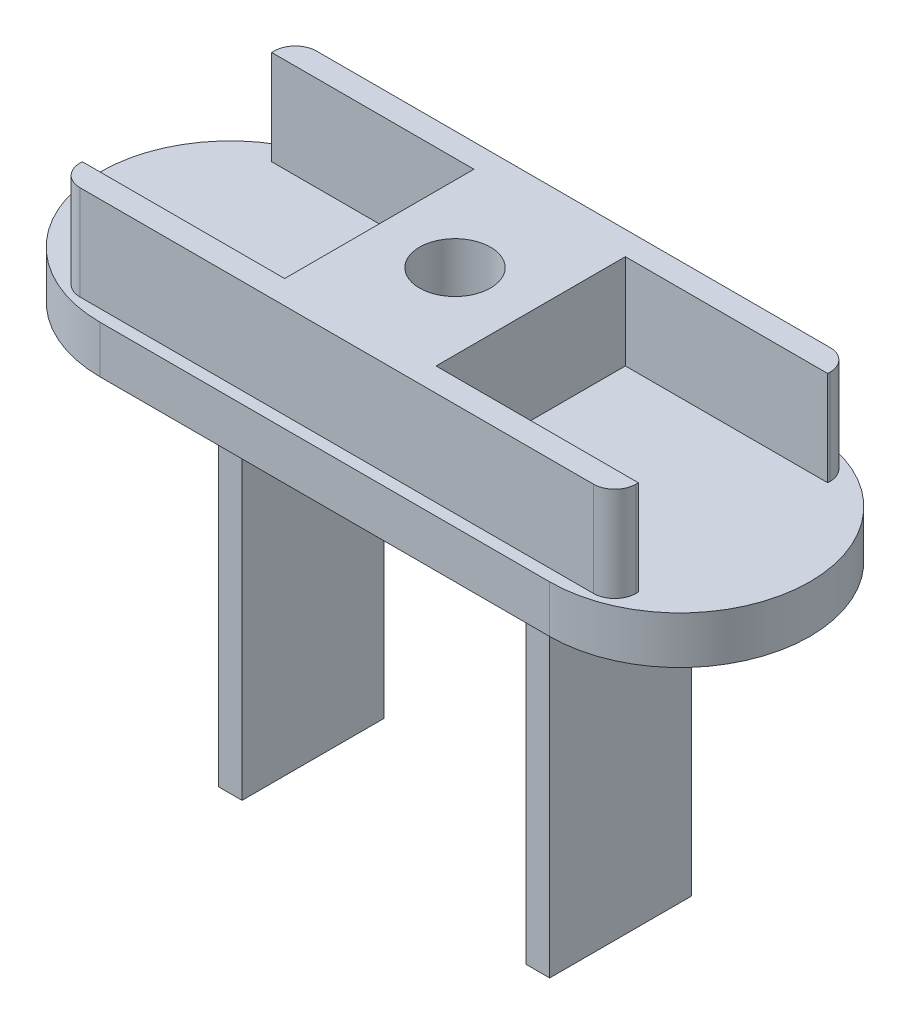
ISO-10303-21;
HEADER;
FILE_DESCRIPTION(('STEP AP214'),'2;1');
FILE_NAME('part.step','',(''),(''),'','','');
FILE_SCHEMA(('AUTOMOTIVE_DESIGN { 1 0 10303 214 1 1 1 1 }'));
ENDSEC;
DATA;
#1=APPLICATION_CONTEXT('core data for automotive mechanical design processes');
#2=APPLICATION_PROTOCOL_DEFINITION('international standard','automotive_design',2000,#1);
#3=PRODUCT_CONTEXT('',#1,'mechanical');
#4=PRODUCT('Part','Part','',(#3));
#5=PRODUCT_RELATED_PRODUCT_CATEGORY('part','',(#4));
#6=PRODUCT_DEFINITION_FORMATION('','',#4);
#7=PRODUCT_DEFINITION_CONTEXT('part definition',#1,'design');
#8=PRODUCT_DEFINITION('design','',#6,#7);
#9=PRODUCT_DEFINITION_SHAPE('','',#8);
#10=(LENGTH_UNIT() NAMED_UNIT(*) SI_UNIT(.MILLI.,.METRE.));
#11=(NAMED_UNIT(*) PLANE_ANGLE_UNIT() SI_UNIT($,.RADIAN.));
#12=(NAMED_UNIT(*) SI_UNIT($,.STERADIAN.) SOLID_ANGLE_UNIT());
#13=UNCERTAINTY_MEASURE_WITH_UNIT(LENGTH_MEASURE(1.E-05),#10,'distance_accuracy_value','');
#14=(GEOMETRIC_REPRESENTATION_CONTEXT(3) GLOBAL_UNCERTAINTY_ASSIGNED_CONTEXT((#13)) GLOBAL_UNIT_ASSIGNED_CONTEXT((#10,
#11,#12)) REPRESENTATION_CONTEXT('',''));
#15=CARTESIAN_POINT('',(0.,0.,0.));
#16=DIRECTION('',(0.,0.,1.));
#17=DIRECTION('',(1.,0.,0.));
#18=AXIS2_PLACEMENT_3D('',#15,#16,#17);
#19=CARTESIAN_POINT('',(-9.5,0.,0.));
#20=DIRECTION('',(0.,1.,0.));
#21=DIRECTION('',(0.,0.,1.));
#22=AXIS2_PLACEMENT_3D('',#19,#20,#21);
#23=PLANE('',#22);
#24=DIRECTION('',(0.,0.,-1.));
#25=VECTOR('',#24,1.);
#26=CARTESIAN_POINT('',(-7.,0.,3.));
#27=LINE('',#26,#25);
#28=CARTESIAN_POINT('',(-7.,0.,3.));
#29=VERTEX_POINT('',#28);
#30=CARTESIAN_POINT('',(-7.,0.,-3.));
#31=VERTEX_POINT('',#30);
#32=EDGE_CURVE('E251',#29,#31,#27,.T.);
#33=ORIENTED_EDGE('',*,*,#32,.F.);
#34=DIRECTION('',(-1.,0.,0.));
#35=VECTOR('',#34,1.);
#36=CARTESIAN_POINT('',(-7.,0.,3.));
#37=LINE('',#36,#35);
#38=CARTESIAN_POINT('',(-6.,0.,3.));
#39=VERTEX_POINT('',#38);
#40=EDGE_CURVE('E267',#39,#29,#37,.T.);
#41=ORIENTED_EDGE('',*,*,#40,.F.);
#42=DIRECTION('',(0.,0.,1.));
#43=VECTOR('',#42,1.);
#44=CARTESIAN_POINT('',(-6.,0.,3.));
#45=LINE('',#44,#43);
#46=CARTESIAN_POINT('',(-6.,0.,-3.));
#47=VERTEX_POINT('',#46);
#48=EDGE_CURVE('E280',#47,#39,#45,.T.);
#49=ORIENTED_EDGE('',*,*,#48,.F.);
#50=DIRECTION('',(1.,0.,0.));
#51=VECTOR('',#50,1.);
#52=CARTESIAN_POINT('',(-7.,0.,-3.));
#53=LINE('',#52,#51);
#54=EDGE_CURVE('E256',#31,#47,#53,.T.);
#55=ORIENTED_EDGE('',*,*,#54,.F.);
#56=EDGE_LOOP('',(#33,#41,#49,#55));
#57=FACE_BOUND('',#56,.T.);
#58=CARTESIAN_POINT('',(0.,0.,0.));
#59=DIRECTION('',(0.,1.,0.));
#60=DIRECTION('',(0.,0.,1.));
#61=AXIS2_PLACEMENT_3D('',#58,#59,#60);
#62=CIRCLE('',#61,1.5);
#63=CARTESIAN_POINT('',(0.,0.,1.5));
#64=VERTEX_POINT('',#63);
#65=EDGE_CURVE('E306',#64,#64,#62,.F.);
#66=ORIENTED_EDGE('',*,*,#65,.F.);
#67=EDGE_LOOP('',(#66));
#68=FACE_BOUND('',#67,.T.);
#69=CARTESIAN_POINT('',(-9.5,0.,0.));
#70=DIRECTION('',(0.,1.,0.));
#71=DIRECTION('',(0.,0.,1.));
#72=AXIS2_PLACEMENT_3D('',#69,#70,#71);
#73=CIRCLE('',#72,5.5);
#74=CARTESIAN_POINT('',(-9.5,0.,-5.5));
#75=VERTEX_POINT('',#74);
#76=CARTESIAN_POINT('',(-9.5,0.,5.5));
#77=VERTEX_POINT('',#76);
#78=EDGE_CURVE('E471',#75,#77,#73,.T.);
#79=ORIENTED_EDGE('',*,*,#78,.F.);
#80=DIRECTION('',(-1.,0.,0.));
#81=VECTOR('',#80,1.);
#82=CARTESIAN_POINT('',(-9.5,0.,-5.5));
#83=LINE('',#82,#81);
#84=CARTESIAN_POINT('',(9.5,0.,-5.5));
#85=VERTEX_POINT('',#84);
#86=EDGE_CURVE('E477',#85,#75,#83,.T.);
#87=ORIENTED_EDGE('',*,*,#86,.F.);
#88=CARTESIAN_POINT('',(9.5,0.,0.));
#89=DIRECTION('',(0.,1.,0.));
#90=DIRECTION('',(0.,0.,1.));
#91=AXIS2_PLACEMENT_3D('',#88,#89,#90);
#92=CIRCLE('',#91,5.5);
#93=CARTESIAN_POINT('',(9.5,0.,5.50000000000001));
#94=VERTEX_POINT('',#93);
#95=EDGE_CURVE('E493',#94,#85,#92,.T.);
#96=ORIENTED_EDGE('',*,*,#95,.F.);
#97=DIRECTION('',(1.,0.,0.));
#98=VECTOR('',#97,1.);
#99=CARTESIAN_POINT('',(-9.5,0.,5.5));
#100=LINE('',#99,#98);
#101=EDGE_CURVE('E490',#77,#94,#100,.T.);
#102=ORIENTED_EDGE('',*,*,#101,.F.);
#103=EDGE_LOOP('',(#79,#87,#96,#102));
#104=FACE_BOUND('',#103,.T.);
#105=DIRECTION('',(0.,0.,-1.));
#106=VECTOR('',#105,1.);
#107=CARTESIAN_POINT('',(6.,0.,3.));
#108=LINE('',#107,#106);
#109=CARTESIAN_POINT('',(6.,0.,3.));
#110=VERTEX_POINT('',#109);
#111=CARTESIAN_POINT('',(6.,0.,-3.));
#112=VERTEX_POINT('',#111);
#113=EDGE_CURVE('E249',#110,#112,#108,.T.);
#114=ORIENTED_EDGE('',*,*,#113,.F.);
#115=DIRECTION('',(-1.,0.,0.));
#116=VECTOR('',#115,1.);
#117=CARTESIAN_POINT('',(6.,0.,3.));
#118=LINE('',#117,#116);
#119=CARTESIAN_POINT('',(7.,0.,3.));
#120=VERTEX_POINT('',#119);
#121=EDGE_CURVE('E246',#120,#110,#118,.T.);
#122=ORIENTED_EDGE('',*,*,#121,.F.);
#123=DIRECTION('',(0.,0.,1.));
#124=VECTOR('',#123,1.);
#125=CARTESIAN_POINT('',(7.,0.,3.));
#126=LINE('',#125,#124);
#127=CARTESIAN_POINT('',(7.00000000000001,0.,-3.));
#128=VERTEX_POINT('',#127);
#129=EDGE_CURVE('E62',#128,#120,#126,.T.);
#130=ORIENTED_EDGE('',*,*,#129,.F.);
#131=DIRECTION('',(1.,0.,0.));
#132=VECTOR('',#131,1.);
#133=CARTESIAN_POINT('',(6.,0.,-3.));
#134=LINE('',#133,#132);
#135=EDGE_CURVE('E57',#112,#128,#134,.T.);
#136=ORIENTED_EDGE('',*,*,#135,.F.);
#137=EDGE_LOOP('',(#114,#122,#130,#136));
#138=FACE_BOUND('',#137,.T.);
#139=ADVANCED_FACE('F41',(#57,#68,#104,#138),#23,.F.);
#140=CARTESIAN_POINT('',(-9.5,2.,0.));
#141=DIRECTION('',(0.,1.,0.));
#142=DIRECTION('',(0.,0.,1.));
#143=AXIS2_PLACEMENT_3D('',#140,#141,#142);
#144=PLANE('',#143);
#145=CARTESIAN_POINT('',(-9.5,2.,0.));
#146=DIRECTION('',(0.,1.,0.));
#147=DIRECTION('',(0.,0.,1.));
#148=AXIS2_PLACEMENT_3D('',#145,#146,#147);
#149=CIRCLE('',#148,5.5);
#150=CARTESIAN_POINT('',(-9.5,2.,-5.5));
#151=VERTEX_POINT('',#150);
#152=CARTESIAN_POINT('',(-9.5,2.,5.5));
#153=VERTEX_POINT('',#152);
#154=EDGE_CURVE('E472',#151,#153,#149,.T.);
#155=ORIENTED_EDGE('',*,*,#154,.T.);
#156=DIRECTION('',(1.,0.,0.));
#157=VECTOR('',#156,1.);
#158=CARTESIAN_POINT('',(-9.5,2.,5.5));
#159=LINE('',#158,#157);
#160=CARTESIAN_POINT('',(9.5,2.,5.50000000000001));
#161=VERTEX_POINT('',#160);
#162=EDGE_CURVE('E476',#153,#161,#159,.T.);
#163=ORIENTED_EDGE('',*,*,#162,.T.);
#164=CARTESIAN_POINT('',(9.5,2.,0.));
#165=DIRECTION('',(0.,1.,0.));
#166=DIRECTION('',(0.,0.,1.));
#167=AXIS2_PLACEMENT_3D('',#164,#165,#166);
#168=CIRCLE('',#167,5.5);
#169=CARTESIAN_POINT('',(9.5,2.,-5.5));
#170=VERTEX_POINT('',#169);
#171=EDGE_CURVE('E480',#161,#170,#168,.T.);
#172=ORIENTED_EDGE('',*,*,#171,.T.);
#173=DIRECTION('',(-1.,0.,0.));
#174=VECTOR('',#173,1.);
#175=CARTESIAN_POINT('',(-9.5,2.,-5.5));
#176=LINE('',#175,#174);
#177=EDGE_CURVE('E483',#170,#151,#176,.T.);
#178=ORIENTED_EDGE('',*,*,#177,.T.);
#179=EDGE_LOOP('',(#155,#163,#172,#178));
#180=FACE_BOUND('',#179,.T.);
#181=DIRECTION('',(0.,0.,1.));
#182=VECTOR('',#181,1.);
#183=CARTESIAN_POINT('',(-3.2,2.,-4.));
#184=LINE('',#183,#182);
#185=CARTESIAN_POINT('',(-3.2,2.,-4.));
#186=VERTEX_POINT('',#185);
#187=CARTESIAN_POINT('',(-3.2,2.,4.));
#188=VERTEX_POINT('',#187);
#189=EDGE_CURVE('E365',#186,#188,#184,.T.);
#190=ORIENTED_EDGE('',*,*,#189,.F.);
#191=DIRECTION('',(1.,0.,0.));
#192=VECTOR('',#191,1.);
#193=CARTESIAN_POINT('',(-11.75,2.,-4.));
#194=LINE('',#193,#192);
#195=CARTESIAN_POINT('',(-11.75,2.,-4.));
#196=VERTEX_POINT('',#195);
#197=EDGE_CURVE('E310',#196,#186,#194,.T.);
#198=ORIENTED_EDGE('',*,*,#197,.F.);
#199=DIRECTION('',(0.,0.,1.));
#200=VECTOR('',#199,1.);
#201=CARTESIAN_POINT('',(-11.75,2.,-4.1));
#202=LINE('',#201,#200);
#203=CARTESIAN_POINT('',(-11.75,2.,-4.1));
#204=VERTEX_POINT('',#203);
#205=EDGE_CURVE('E316',#204,#196,#202,.T.);
#206=ORIENTED_EDGE('',*,*,#205,.F.);
#207=CARTESIAN_POINT('',(-10.85,2.,-4.1));
#208=DIRECTION('',(0.,1.,0.));
#209=DIRECTION('',(0.,0.,1.));
#210=AXIS2_PLACEMENT_3D('',#207,#208,#209);
#211=CIRCLE('',#210,0.899999999999999);
#212=CARTESIAN_POINT('',(-10.85,2.,-5.));
#213=VERTEX_POINT('',#212);
#214=EDGE_CURVE('E404',#213,#204,#211,.T.);
#215=ORIENTED_EDGE('',*,*,#214,.F.);
#216=DIRECTION('',(-1.,0.,0.));
#217=VECTOR('',#216,1.);
#218=CARTESIAN_POINT('',(10.85,2.,-5.));
#219=LINE('',#218,#217);
#220=CARTESIAN_POINT('',(10.85,2.,-5.));
#221=VERTEX_POINT('',#220);
#222=EDGE_CURVE('E401',#221,#213,#219,.T.);
#223=ORIENTED_EDGE('',*,*,#222,.F.);
#224=CARTESIAN_POINT('',(10.85,2.,-4.1));
#225=DIRECTION('',(0.,1.,0.));
#226=DIRECTION('',(0.,0.,1.));
#227=AXIS2_PLACEMENT_3D('',#224,#225,#226);
#228=CIRCLE('',#227,0.899999999999999);
#229=CARTESIAN_POINT('',(11.75,2.,-4.1));
#230=VERTEX_POINT('',#229);
#231=EDGE_CURVE('E398',#230,#221,#228,.T.);
#232=ORIENTED_EDGE('',*,*,#231,.F.);
#233=DIRECTION('',(0.,0.,-1.));
#234=VECTOR('',#233,1.);
#235=CARTESIAN_POINT('',(11.75,2.,-4.));
#236=LINE('',#235,#234);
#237=CARTESIAN_POINT('',(11.75,2.,-4.));
#238=VERTEX_POINT('',#237);
#239=EDGE_CURVE('E395',#238,#230,#236,.T.);
#240=ORIENTED_EDGE('',*,*,#239,.F.);
#241=DIRECTION('',(1.,0.,0.));
#242=VECTOR('',#241,1.);
#243=CARTESIAN_POINT('',(3.2,2.,-4.));
#244=LINE('',#243,#242);
#245=CARTESIAN_POINT('',(3.2,2.,-4.));
#246=VERTEX_POINT('',#245);
#247=EDGE_CURVE('E392',#246,#238,#244,.T.);
#248=ORIENTED_EDGE('',*,*,#247,.F.);
#249=DIRECTION('',(0.,0.,-1.));
#250=VECTOR('',#249,1.);
#251=CARTESIAN_POINT('',(3.2,2.,4.));
#252=LINE('',#251,#250);
#253=CARTESIAN_POINT('',(3.2,2.,4.));
#254=VERTEX_POINT('',#253);
#255=EDGE_CURVE('E389',#254,#246,#252,.T.);
#256=ORIENTED_EDGE('',*,*,#255,.F.);
#257=DIRECTION('',(-1.,0.,0.));
#258=VECTOR('',#257,1.);
#259=CARTESIAN_POINT('',(11.75,2.,4.));
#260=LINE('',#259,#258);
#261=CARTESIAN_POINT('',(11.75,2.,4.));
#262=VERTEX_POINT('',#261);
#263=EDGE_CURVE('E386',#262,#254,#260,.T.);
#264=ORIENTED_EDGE('',*,*,#263,.F.);
#265=DIRECTION('',(0.,0.,-1.));
#266=VECTOR('',#265,1.);
#267=CARTESIAN_POINT('',(11.75,2.,4.1));
#268=LINE('',#267,#266);
#269=CARTESIAN_POINT('',(11.75,2.,4.1));
#270=VERTEX_POINT('',#269);
#271=EDGE_CURVE('E383',#270,#262,#268,.T.);
#272=ORIENTED_EDGE('',*,*,#271,.F.);
#273=CARTESIAN_POINT('',(10.85,2.,4.1));
#274=DIRECTION('',(0.,1.,0.));
#275=DIRECTION('',(0.,0.,1.));
#276=AXIS2_PLACEMENT_3D('',#273,#274,#275);
#277=CIRCLE('',#276,0.899999999999999);
#278=CARTESIAN_POINT('',(10.85,2.,5.));
#279=VERTEX_POINT('',#278);
#280=EDGE_CURVE('E380',#279,#270,#277,.T.);
#281=ORIENTED_EDGE('',*,*,#280,.F.);
#282=DIRECTION('',(1.,0.,0.));
#283=VECTOR('',#282,1.);
#284=CARTESIAN_POINT('',(-10.85,2.,5.));
#285=LINE('',#284,#283);
#286=CARTESIAN_POINT('',(-10.85,2.,5.));
#287=VERTEX_POINT('',#286);
#288=EDGE_CURVE('E377',#287,#279,#285,.T.);
#289=ORIENTED_EDGE('',*,*,#288,.F.);
#290=CARTESIAN_POINT('',(-10.85,2.,4.1));
#291=DIRECTION('',(0.,1.,0.));
#292=DIRECTION('',(0.,0.,1.));
#293=AXIS2_PLACEMENT_3D('',#290,#291,#292);
#294=CIRCLE('',#293,0.899999999999999);
#295=CARTESIAN_POINT('',(-11.75,2.,4.1));
#296=VERTEX_POINT('',#295);
#297=EDGE_CURVE('E374',#296,#287,#294,.T.);
#298=ORIENTED_EDGE('',*,*,#297,.F.);
#299=DIRECTION('',(0.,0.,1.));
#300=VECTOR('',#299,1.);
#301=CARTESIAN_POINT('',(-11.75,2.,4.));
#302=LINE('',#301,#300);
#303=CARTESIAN_POINT('',(-11.75,2.,4.));
#304=VERTEX_POINT('',#303);
#305=EDGE_CURVE('E371',#304,#296,#302,.T.);
#306=ORIENTED_EDGE('',*,*,#305,.F.);
#307=DIRECTION('',(-1.,0.,0.));
#308=VECTOR('',#307,1.);
#309=CARTESIAN_POINT('',(-3.2,2.,4.));
#310=LINE('',#309,#308);
#311=EDGE_CURVE('E368',#188,#304,#310,.T.);
#312=ORIENTED_EDGE('',*,*,#311,.F.);
#313=EDGE_LOOP('',(#190,#198,#206,#215,#223,#232,#240,#248,#256,#264,#272,#281,#289,#298,#306,#312));
#314=FACE_BOUND('',#313,.T.);
#315=ADVANCED_FACE('F524',(#180,#314),#144,.T.);
#316=CARTESIAN_POINT('',(-9.5,2.,0.));
#317=DIRECTION('',(0.,-1.,0.));
#318=DIRECTION('',(0.,0.,-1.));
#319=AXIS2_PLACEMENT_3D('',#316,#317,#318);
#320=CYLINDRICAL_SURFACE('',#319,5.5);
#321=ORIENTED_EDGE('',*,*,#78,.T.);
#322=DIRECTION('',(0.,-1.,0.));
#323=VECTOR('',#322,1.);
#324=CARTESIAN_POINT('',(-9.5,2.,5.5));
#325=LINE('',#324,#323);
#326=EDGE_CURVE('E11',#153,#77,#325,.T.);
#327=ORIENTED_EDGE('',*,*,#326,.F.);
#328=ORIENTED_EDGE('',*,*,#154,.F.);
#329=DIRECTION('',(0.,-1.,0.));
#330=VECTOR('',#329,1.);
#331=CARTESIAN_POINT('',(-9.5,2.,-5.5));
#332=LINE('',#331,#330);
#333=EDGE_CURVE('E486',#151,#75,#332,.T.);
#334=ORIENTED_EDGE('',*,*,#333,.T.);
#335=EDGE_LOOP('',(#321,#327,#328,#334));
#336=FACE_BOUND('',#335,.T.);
#337=ADVANCED_FACE('F43',(#336),#320,.T.);
#338=CARTESIAN_POINT('',(-9.5,2.,5.5));
#339=DIRECTION('',(0.,0.,-1.));
#340=DIRECTION('',(-1.,0.,0.));
#341=AXIS2_PLACEMENT_3D('',#338,#339,#340);
#342=PLANE('',#341);
#343=ORIENTED_EDGE('',*,*,#101,.T.);
#344=DIRECTION('',(0.,-1.,0.));
#345=VECTOR('',#344,1.);
#346=CARTESIAN_POINT('',(9.5,2.,5.50000000000001));
#347=LINE('',#346,#345);
#348=EDGE_CURVE('E50',#161,#94,#347,.T.);
#349=ORIENTED_EDGE('',*,*,#348,.F.);
#350=ORIENTED_EDGE('',*,*,#162,.F.);
#351=ORIENTED_EDGE('',*,*,#326,.T.);
#352=EDGE_LOOP('',(#343,#349,#350,#351));
#353=FACE_BOUND('',#352,.T.);
#354=ADVANCED_FACE('F526',(#353),#342,.F.);
#355=CARTESIAN_POINT('',(9.5,2.,0.));
#356=DIRECTION('',(0.,-1.,0.));
#357=DIRECTION('',(0.,0.,-1.));
#358=AXIS2_PLACEMENT_3D('',#355,#356,#357);
#359=CYLINDRICAL_SURFACE('',#358,5.5);
#360=ORIENTED_EDGE('',*,*,#95,.T.);
#361=DIRECTION('',(0.,-1.,0.));
#362=VECTOR('',#361,1.);
#363=CARTESIAN_POINT('',(9.5,2.,-5.5));
#364=LINE('',#363,#362);
#365=EDGE_CURVE('E501',#170,#85,#364,.T.);
#366=ORIENTED_EDGE('',*,*,#365,.F.);
#367=ORIENTED_EDGE('',*,*,#171,.F.);
#368=ORIENTED_EDGE('',*,*,#348,.T.);
#369=EDGE_LOOP('',(#360,#366,#367,#368));
#370=FACE_BOUND('',#369,.T.);
#371=ADVANCED_FACE('F510',(#370),#359,.T.);
#372=CARTESIAN_POINT('',(-9.5,2.,-5.5));
#373=DIRECTION('',(0.,0.,1.));
#374=DIRECTION('',(1.,0.,0.));
#375=AXIS2_PLACEMENT_3D('',#372,#373,#374);
#376=PLANE('',#375);
#377=ORIENTED_EDGE('',*,*,#86,.T.);
#378=ORIENTED_EDGE('',*,*,#333,.F.);
#379=ORIENTED_EDGE('',*,*,#177,.F.);
#380=ORIENTED_EDGE('',*,*,#365,.T.);
#381=EDGE_LOOP('',(#377,#378,#379,#380));
#382=FACE_BOUND('',#381,.T.);
#383=ADVANCED_FACE('F518',(#382),#376,.F.);
#384=CARTESIAN_POINT('',(-11.75,6.,-4.));
#385=DIRECTION('',(0.,0.,-1.));
#386=DIRECTION('',(-1.,0.,0.));
#387=AXIS2_PLACEMENT_3D('',#384,#385,#386);
#388=PLANE('',#387);
#389=ORIENTED_EDGE('',*,*,#197,.T.);
#390=DIRECTION('',(0.,-1.,0.));
#391=VECTOR('',#390,1.);
#392=CARTESIAN_POINT('',(-3.2,6.,-4.));
#393=LINE('',#392,#391);
#394=CARTESIAN_POINT('',(-3.2,6.,-4.));
#395=VERTEX_POINT('',#394);
#396=EDGE_CURVE('E468',#395,#186,#393,.T.);
#397=ORIENTED_EDGE('',*,*,#396,.F.);
#398=DIRECTION('',(1.,0.,0.));
#399=VECTOR('',#398,1.);
#400=CARTESIAN_POINT('',(-11.75,6.,-4.));
#401=LINE('',#400,#399);
#402=CARTESIAN_POINT('',(-11.75,6.,-4.));
#403=VERTEX_POINT('',#402);
#404=EDGE_CURVE('E311',#403,#395,#401,.T.);
#405=ORIENTED_EDGE('',*,*,#404,.F.);
#406=DIRECTION('',(0.,-1.,0.));
#407=VECTOR('',#406,1.);
#408=CARTESIAN_POINT('',(-11.75,6.,-4.));
#409=LINE('',#408,#407);
#410=EDGE_CURVE('E361',#403,#196,#409,.T.);
#411=ORIENTED_EDGE('',*,*,#410,.T.);
#412=EDGE_LOOP('',(#389,#397,#405,#411));
#413=FACE_BOUND('',#412,.T.);
#414=ADVANCED_FACE('F544',(#413),#388,.F.);
#415=CARTESIAN_POINT('',(-3.2,6.,-4.));
#416=DIRECTION('',(1.,0.,0.));
#417=DIRECTION('',(0.,0.,-1.));
#418=AXIS2_PLACEMENT_3D('',#415,#416,#417);
#419=PLANE('',#418);
#420=ORIENTED_EDGE('',*,*,#189,.T.);
#421=DIRECTION('',(0.,-1.,0.));
#422=VECTOR('',#421,1.);
#423=CARTESIAN_POINT('',(-3.2,6.,4.));
#424=LINE('',#423,#422);
#425=CARTESIAN_POINT('',(-3.2,6.,4.));
#426=VERTEX_POINT('',#425);
#427=EDGE_CURVE('E464',#426,#188,#424,.T.);
#428=ORIENTED_EDGE('',*,*,#427,.F.);
#429=DIRECTION('',(0.,0.,1.));
#430=VECTOR('',#429,1.);
#431=CARTESIAN_POINT('',(-3.2,6.,-4.));
#432=LINE('',#431,#430);
#433=EDGE_CURVE('E315',#395,#426,#432,.T.);
#434=ORIENTED_EDGE('',*,*,#433,.F.);
#435=ORIENTED_EDGE('',*,*,#396,.T.);
#436=EDGE_LOOP('',(#420,#428,#434,#435));
#437=FACE_BOUND('',#436,.T.);
#438=ADVANCED_FACE('F548',(#437),#419,.F.);
#439=CARTESIAN_POINT('',(-3.2,6.,4.));
#440=DIRECTION('',(0.,0.,1.));
#441=DIRECTION('',(1.,0.,0.));
#442=AXIS2_PLACEMENT_3D('',#439,#440,#441);
#443=PLANE('',#442);
#444=ORIENTED_EDGE('',*,*,#311,.T.);
#445=DIRECTION('',(0.,-1.,0.));
#446=VECTOR('',#445,1.);
#447=CARTESIAN_POINT('',(-11.75,6.,4.));
#448=LINE('',#447,#446);
#449=CARTESIAN_POINT('',(-11.75,6.,4.));
#450=VERTEX_POINT('',#449);
#451=EDGE_CURVE('E460',#450,#304,#448,.T.);
#452=ORIENTED_EDGE('',*,*,#451,.F.);
#453=DIRECTION('',(-1.,0.,0.));
#454=VECTOR('',#453,1.);
#455=CARTESIAN_POINT('',(-3.2,6.,4.));
#456=LINE('',#455,#454);
#457=EDGE_CURVE('E319',#426,#450,#456,.T.);
#458=ORIENTED_EDGE('',*,*,#457,.F.);
#459=ORIENTED_EDGE('',*,*,#427,.T.);
#460=EDGE_LOOP('',(#444,#452,#458,#459));
#461=FACE_BOUND('',#460,.T.);
#462=ADVANCED_FACE('F553',(#461),#443,.F.);
#463=CARTESIAN_POINT('',(-11.75,6.,4.));
#464=DIRECTION('',(1.,0.,0.));
#465=DIRECTION('',(0.,0.,-1.));
#466=AXIS2_PLACEMENT_3D('',#463,#464,#465);
#467=PLANE('',#466);
#468=ORIENTED_EDGE('',*,*,#305,.T.);
#469=DIRECTION('',(0.,-1.,0.));
#470=VECTOR('',#469,1.);
#471=CARTESIAN_POINT('',(-11.75,6.,4.1));
#472=LINE('',#471,#470);
#473=CARTESIAN_POINT('',(-11.75,6.,4.1));
#474=VERTEX_POINT('',#473);
#475=EDGE_CURVE('E456',#474,#296,#472,.T.);
#476=ORIENTED_EDGE('',*,*,#475,.F.);
#477=DIRECTION('',(0.,0.,1.));
#478=VECTOR('',#477,1.);
#479=CARTESIAN_POINT('',(-11.75,6.,4.));
#480=LINE('',#479,#478);
#481=EDGE_CURVE('E322',#450,#474,#480,.T.);
#482=ORIENTED_EDGE('',*,*,#481,.F.);
#483=ORIENTED_EDGE('',*,*,#451,.T.);
#484=EDGE_LOOP('',(#468,#476,#482,#483));
#485=FACE_BOUND('',#484,.T.);
#486=ADVANCED_FACE('F559',(#485),#467,.F.);
#487=CARTESIAN_POINT('',(-10.85,6.,4.1));
#488=DIRECTION('',(0.,-1.,0.));
#489=DIRECTION('',(0.,0.,-1.));
#490=AXIS2_PLACEMENT_3D('',#487,#488,#489);
#491=CYLINDRICAL_SURFACE('',#490,0.899999999999999);
#492=ORIENTED_EDGE('',*,*,#297,.T.);
#493=DIRECTION('',(0.,-1.,0.));
#494=VECTOR('',#493,1.);
#495=CARTESIAN_POINT('',(-10.85,6.,5.));
#496=LINE('',#495,#494);
#497=CARTESIAN_POINT('',(-10.85,6.,5.));
#498=VERTEX_POINT('',#497);
#499=EDGE_CURVE('E452',#498,#287,#496,.T.);
#500=ORIENTED_EDGE('',*,*,#499,.F.);
#501=CARTESIAN_POINT('',(-10.85,6.,4.1));
#502=DIRECTION('',(0.,1.,0.));
#503=DIRECTION('',(0.,0.,1.));
#504=AXIS2_PLACEMENT_3D('',#501,#502,#503);
#505=CIRCLE('',#504,0.899999999999999);
#506=EDGE_CURVE('E325',#474,#498,#505,.T.);
#507=ORIENTED_EDGE('',*,*,#506,.F.);
#508=ORIENTED_EDGE('',*,*,#475,.T.);
#509=EDGE_LOOP('',(#492,#500,#507,#508));
#510=FACE_BOUND('',#509,.T.);
#511=ADVANCED_FACE('F563',(#510),#491,.T.);
#512=CARTESIAN_POINT('',(-10.85,6.,5.));
#513=DIRECTION('',(0.,0.,-1.));
#514=DIRECTION('',(-1.,0.,0.));
#515=AXIS2_PLACEMENT_3D('',#512,#513,#514);
#516=PLANE('',#515);
#517=ORIENTED_EDGE('',*,*,#288,.T.);
#518=DIRECTION('',(0.,-1.,0.));
#519=VECTOR('',#518,1.);
#520=CARTESIAN_POINT('',(10.85,6.,5.));
#521=LINE('',#520,#519);
#522=CARTESIAN_POINT('',(10.85,6.,5.));
#523=VERTEX_POINT('',#522);
#524=EDGE_CURVE('E448',#523,#279,#521,.T.);
#525=ORIENTED_EDGE('',*,*,#524,.F.);
#526=DIRECTION('',(1.,0.,0.));
#527=VECTOR('',#526,1.);
#528=CARTESIAN_POINT('',(-10.85,6.,5.));
#529=LINE('',#528,#527);
#530=EDGE_CURVE('E328',#498,#523,#529,.T.);
#531=ORIENTED_EDGE('',*,*,#530,.F.);
#532=ORIENTED_EDGE('',*,*,#499,.T.);
#533=EDGE_LOOP('',(#517,#525,#531,#532));
#534=FACE_BOUND('',#533,.T.);
#535=ADVANCED_FACE('F567',(#534),#516,.F.);
#536=CARTESIAN_POINT('',(10.85,6.,4.1));
#537=DIRECTION('',(0.,-1.,0.));
#538=DIRECTION('',(0.,0.,-1.));
#539=AXIS2_PLACEMENT_3D('',#536,#537,#538);
#540=CYLINDRICAL_SURFACE('',#539,0.899999999999999);
#541=ORIENTED_EDGE('',*,*,#280,.T.);
#542=DIRECTION('',(0.,-1.,0.));
#543=VECTOR('',#542,1.);
#544=CARTESIAN_POINT('',(11.75,6.,4.1));
#545=LINE('',#544,#543);
#546=CARTESIAN_POINT('',(11.75,6.,4.1));
#547=VERTEX_POINT('',#546);
#548=EDGE_CURVE('E444',#547,#270,#545,.T.);
#549=ORIENTED_EDGE('',*,*,#548,.F.);
#550=CARTESIAN_POINT('',(10.85,6.,4.1));
#551=DIRECTION('',(0.,1.,0.));
#552=DIRECTION('',(0.,0.,1.));
#553=AXIS2_PLACEMENT_3D('',#550,#551,#552);
#554=CIRCLE('',#553,0.899999999999999);
#555=EDGE_CURVE('E331',#523,#547,#554,.T.);
#556=ORIENTED_EDGE('',*,*,#555,.F.);
#557=ORIENTED_EDGE('',*,*,#524,.T.);
#558=EDGE_LOOP('',(#541,#549,#556,#557));
#559=FACE_BOUND('',#558,.T.);
#560=ADVANCED_FACE('F571',(#559),#540,.T.);
#561=CARTESIAN_POINT('',(11.75,6.,4.1));
#562=DIRECTION('',(-1.,0.,0.));
#563=DIRECTION('',(0.,0.,1.));
#564=AXIS2_PLACEMENT_3D('',#561,#562,#563);
#565=PLANE('',#564);
#566=ORIENTED_EDGE('',*,*,#271,.T.);
#567=DIRECTION('',(0.,-1.,0.));
#568=VECTOR('',#567,1.);
#569=CARTESIAN_POINT('',(11.75,6.,4.));
#570=LINE('',#569,#568);
#571=CARTESIAN_POINT('',(11.75,6.,4.));
#572=VERTEX_POINT('',#571);
#573=EDGE_CURVE('E440',#572,#262,#570,.T.);
#574=ORIENTED_EDGE('',*,*,#573,.F.);
#575=DIRECTION('',(0.,0.,-1.));
#576=VECTOR('',#575,1.);
#577=CARTESIAN_POINT('',(11.75,6.,4.1));
#578=LINE('',#577,#576);
#579=EDGE_CURVE('E334',#547,#572,#578,.T.);
#580=ORIENTED_EDGE('',*,*,#579,.F.);
#581=ORIENTED_EDGE('',*,*,#548,.T.);
#582=EDGE_LOOP('',(#566,#574,#580,#581));
#583=FACE_BOUND('',#582,.T.);
#584=ADVANCED_FACE('F575',(#583),#565,.F.);
#585=CARTESIAN_POINT('',(11.75,6.,4.));
#586=DIRECTION('',(0.,0.,1.));
#587=DIRECTION('',(1.,0.,0.));
#588=AXIS2_PLACEMENT_3D('',#585,#586,#587);
#589=PLANE('',#588);
#590=ORIENTED_EDGE('',*,*,#263,.T.);
#591=DIRECTION('',(0.,-1.,0.));
#592=VECTOR('',#591,1.);
#593=CARTESIAN_POINT('',(3.2,6.,4.));
#594=LINE('',#593,#592);
#595=CARTESIAN_POINT('',(3.2,6.,4.));
#596=VERTEX_POINT('',#595);
#597=EDGE_CURVE('E436',#596,#254,#594,.T.);
#598=ORIENTED_EDGE('',*,*,#597,.F.);
#599=DIRECTION('',(-1.,0.,0.));
#600=VECTOR('',#599,1.);
#601=CARTESIAN_POINT('',(11.75,6.,4.));
#602=LINE('',#601,#600);
#603=EDGE_CURVE('E337',#572,#596,#602,.T.);
#604=ORIENTED_EDGE('',*,*,#603,.F.);
#605=ORIENTED_EDGE('',*,*,#573,.T.);
#606=EDGE_LOOP('',(#590,#598,#604,#605));
#607=FACE_BOUND('',#606,.T.);
#608=ADVANCED_FACE('F579',(#607),#589,.F.);
#609=CARTESIAN_POINT('',(3.2,6.,4.));
#610=DIRECTION('',(-1.,0.,0.));
#611=DIRECTION('',(0.,0.,1.));
#612=AXIS2_PLACEMENT_3D('',#609,#610,#611);
#613=PLANE('',#612);
#614=ORIENTED_EDGE('',*,*,#255,.T.);
#615=DIRECTION('',(0.,-1.,0.));
#616=VECTOR('',#615,1.);
#617=CARTESIAN_POINT('',(3.2,6.,-4.));
#618=LINE('',#617,#616);
#619=CARTESIAN_POINT('',(3.2,6.,-4.));
#620=VERTEX_POINT('',#619);
#621=EDGE_CURVE('E432',#620,#246,#618,.T.);
#622=ORIENTED_EDGE('',*,*,#621,.F.);
#623=DIRECTION('',(0.,0.,-1.));
#624=VECTOR('',#623,1.);
#625=CARTESIAN_POINT('',(3.2,6.,4.));
#626=LINE('',#625,#624);
#627=EDGE_CURVE('E340',#596,#620,#626,.T.);
#628=ORIENTED_EDGE('',*,*,#627,.F.);
#629=ORIENTED_EDGE('',*,*,#597,.T.);
#630=EDGE_LOOP('',(#614,#622,#628,#629));
#631=FACE_BOUND('',#630,.T.);
#632=ADVANCED_FACE('F583',(#631),#613,.F.);
#633=CARTESIAN_POINT('',(3.2,6.,-4.));
#634=DIRECTION('',(0.,0.,-1.));
#635=DIRECTION('',(-1.,0.,0.));
#636=AXIS2_PLACEMENT_3D('',#633,#634,#635);
#637=PLANE('',#636);
#638=ORIENTED_EDGE('',*,*,#247,.T.);
#639=DIRECTION('',(0.,-1.,0.));
#640=VECTOR('',#639,1.);
#641=CARTESIAN_POINT('',(11.75,6.,-4.));
#642=LINE('',#641,#640);
#643=CARTESIAN_POINT('',(11.75,6.,-4.));
#644=VERTEX_POINT('',#643);
#645=EDGE_CURVE('E428',#644,#238,#642,.T.);
#646=ORIENTED_EDGE('',*,*,#645,.F.);
#647=DIRECTION('',(1.,0.,0.));
#648=VECTOR('',#647,1.);
#649=CARTESIAN_POINT('',(3.2,6.,-4.));
#650=LINE('',#649,#648);
#651=EDGE_CURVE('E343',#620,#644,#650,.T.);
#652=ORIENTED_EDGE('',*,*,#651,.F.);
#653=ORIENTED_EDGE('',*,*,#621,.T.);
#654=EDGE_LOOP('',(#638,#646,#652,#653));
#655=FACE_BOUND('',#654,.T.);
#656=ADVANCED_FACE('F587',(#655),#637,.F.);
#657=CARTESIAN_POINT('',(11.75,6.,-4.));
#658=DIRECTION('',(-1.,0.,0.));
#659=DIRECTION('',(0.,0.,1.));
#660=AXIS2_PLACEMENT_3D('',#657,#658,#659);
#661=PLANE('',#660);
#662=ORIENTED_EDGE('',*,*,#239,.T.);
#663=DIRECTION('',(0.,-1.,0.));
#664=VECTOR('',#663,1.);
#665=CARTESIAN_POINT('',(11.75,6.,-4.1));
#666=LINE('',#665,#664);
#667=CARTESIAN_POINT('',(11.75,6.,-4.1));
#668=VERTEX_POINT('',#667);
#669=EDGE_CURVE('E424',#668,#230,#666,.T.);
#670=ORIENTED_EDGE('',*,*,#669,.F.);
#671=DIRECTION('',(0.,0.,-1.));
#672=VECTOR('',#671,1.);
#673=CARTESIAN_POINT('',(11.75,6.,-4.));
#674=LINE('',#673,#672);
#675=EDGE_CURVE('E346',#644,#668,#674,.T.);
#676=ORIENTED_EDGE('',*,*,#675,.F.);
#677=ORIENTED_EDGE('',*,*,#645,.T.);
#678=EDGE_LOOP('',(#662,#670,#676,#677));
#679=FACE_BOUND('',#678,.T.);
#680=ADVANCED_FACE('F591',(#679),#661,.F.);
#681=CARTESIAN_POINT('',(10.85,6.,-4.1));
#682=DIRECTION('',(0.,-1.,0.));
#683=DIRECTION('',(0.,0.,-1.));
#684=AXIS2_PLACEMENT_3D('',#681,#682,#683);
#685=CYLINDRICAL_SURFACE('',#684,0.899999999999999);
#686=ORIENTED_EDGE('',*,*,#231,.T.);
#687=DIRECTION('',(0.,-1.,0.));
#688=VECTOR('',#687,1.);
#689=CARTESIAN_POINT('',(10.85,6.,-5.));
#690=LINE('',#689,#688);
#691=CARTESIAN_POINT('',(10.85,6.,-5.));
#692=VERTEX_POINT('',#691);
#693=EDGE_CURVE('E420',#692,#221,#690,.T.);
#694=ORIENTED_EDGE('',*,*,#693,.F.);
#695=CARTESIAN_POINT('',(10.85,6.,-4.1));
#696=DIRECTION('',(0.,1.,0.));
#697=DIRECTION('',(0.,0.,1.));
#698=AXIS2_PLACEMENT_3D('',#695,#696,#697);
#699=CIRCLE('',#698,0.899999999999999);
#700=EDGE_CURVE('E349',#668,#692,#699,.T.);
#701=ORIENTED_EDGE('',*,*,#700,.F.);
#702=ORIENTED_EDGE('',*,*,#669,.T.);
#703=EDGE_LOOP('',(#686,#694,#701,#702));
#704=FACE_BOUND('',#703,.T.);
#705=ADVANCED_FACE('F595',(#704),#685,.T.);
#706=CARTESIAN_POINT('',(10.85,6.,-5.));
#707=DIRECTION('',(0.,0.,1.));
#708=DIRECTION('',(1.,0.,0.));
#709=AXIS2_PLACEMENT_3D('',#706,#707,#708);
#710=PLANE('',#709);
#711=ORIENTED_EDGE('',*,*,#222,.T.);
#712=DIRECTION('',(0.,-1.,0.));
#713=VECTOR('',#712,1.);
#714=CARTESIAN_POINT('',(-10.85,6.,-5.));
#715=LINE('',#714,#713);
#716=CARTESIAN_POINT('',(-10.85,6.,-5.));
#717=VERTEX_POINT('',#716);
#718=EDGE_CURVE('E416',#717,#213,#715,.T.);
#719=ORIENTED_EDGE('',*,*,#718,.F.);
#720=DIRECTION('',(-1.,0.,0.));
#721=VECTOR('',#720,1.);
#722=CARTESIAN_POINT('',(10.85,6.,-5.));
#723=LINE('',#722,#721);
#724=EDGE_CURVE('E352',#692,#717,#723,.T.);
#725=ORIENTED_EDGE('',*,*,#724,.F.);
#726=ORIENTED_EDGE('',*,*,#693,.T.);
#727=EDGE_LOOP('',(#711,#719,#725,#726));
#728=FACE_BOUND('',#727,.T.);
#729=ADVANCED_FACE('F599',(#728),#710,.F.);
#730=CARTESIAN_POINT('',(-10.85,6.,-4.1));
#731=DIRECTION('',(0.,-1.,0.));
#732=DIRECTION('',(0.,0.,-1.));
#733=AXIS2_PLACEMENT_3D('',#730,#731,#732);
#734=CYLINDRICAL_SURFACE('',#733,0.899999999999999);
#735=ORIENTED_EDGE('',*,*,#214,.T.);
#736=DIRECTION('',(0.,-1.,0.));
#737=VECTOR('',#736,1.);
#738=CARTESIAN_POINT('',(-11.75,6.,-4.1));
#739=LINE('',#738,#737);
#740=CARTESIAN_POINT('',(-11.75,6.,-4.1));
#741=VERTEX_POINT('',#740);
#742=EDGE_CURVE('E413',#741,#204,#739,.T.);
#743=ORIENTED_EDGE('',*,*,#742,.F.);
#744=CARTESIAN_POINT('',(-10.85,6.,-4.1));
#745=DIRECTION('',(0.,1.,0.));
#746=DIRECTION('',(0.,0.,1.));
#747=AXIS2_PLACEMENT_3D('',#744,#745,#746);
#748=CIRCLE('',#747,0.899999999999999);
#749=EDGE_CURVE('E355',#717,#741,#748,.T.);
#750=ORIENTED_EDGE('',*,*,#749,.F.);
#751=ORIENTED_EDGE('',*,*,#718,.T.);
#752=EDGE_LOOP('',(#735,#743,#750,#751));
#753=FACE_BOUND('',#752,.T.);
#754=ADVANCED_FACE('F603',(#753),#734,.T.);
#755=CARTESIAN_POINT('',(-11.75,6.,-4.1));
#756=DIRECTION('',(1.,0.,0.));
#757=DIRECTION('',(0.,0.,-1.));
#758=AXIS2_PLACEMENT_3D('',#755,#756,#757);
#759=PLANE('',#758);
#760=ORIENTED_EDGE('',*,*,#205,.T.);
#761=ORIENTED_EDGE('',*,*,#410,.F.);
#762=DIRECTION('',(0.,0.,1.));
#763=VECTOR('',#762,1.);
#764=CARTESIAN_POINT('',(-11.75,6.,-4.1));
#765=LINE('',#764,#763);
#766=EDGE_CURVE('E358',#741,#403,#765,.T.);
#767=ORIENTED_EDGE('',*,*,#766,.F.);
#768=ORIENTED_EDGE('',*,*,#742,.T.);
#769=EDGE_LOOP('',(#760,#761,#767,#768));
#770=FACE_BOUND('',#769,.T.);
#771=ADVANCED_FACE('F607',(#770),#759,.F.);
#772=CARTESIAN_POINT('',(-10.85,6.,4.1));
#773=DIRECTION('',(0.,1.,0.));
#774=DIRECTION('',(0.,0.,1.));
#775=AXIS2_PLACEMENT_3D('',#772,#773,#774);
#776=PLANE('',#775);
#777=CARTESIAN_POINT('',(0.,6.,0.));
#778=DIRECTION('',(0.,1.,0.));
#779=DIRECTION('',(0.,0.,1.));
#780=AXIS2_PLACEMENT_3D('',#777,#778,#779);
#781=CIRCLE('',#780,1.5);
#782=CARTESIAN_POINT('',(0.,6.,1.5));
#783=VERTEX_POINT('',#782);
#784=EDGE_CURVE('E302',#783,#783,#781,.T.);
#785=ORIENTED_EDGE('',*,*,#784,.F.);
#786=EDGE_LOOP('',(#785));
#787=FACE_BOUND('',#786,.T.);
#788=ORIENTED_EDGE('',*,*,#404,.T.);
#789=ORIENTED_EDGE('',*,*,#433,.T.);
#790=ORIENTED_EDGE('',*,*,#457,.T.);
#791=ORIENTED_EDGE('',*,*,#481,.T.);
#792=ORIENTED_EDGE('',*,*,#506,.T.);
#793=ORIENTED_EDGE('',*,*,#530,.T.);
#794=ORIENTED_EDGE('',*,*,#555,.T.);
#795=ORIENTED_EDGE('',*,*,#579,.T.);
#796=ORIENTED_EDGE('',*,*,#603,.T.);
#797=ORIENTED_EDGE('',*,*,#627,.T.);
#798=ORIENTED_EDGE('',*,*,#651,.T.);
#799=ORIENTED_EDGE('',*,*,#675,.T.);
#800=ORIENTED_EDGE('',*,*,#700,.T.);
#801=ORIENTED_EDGE('',*,*,#724,.T.);
#802=ORIENTED_EDGE('',*,*,#749,.T.);
#803=ORIENTED_EDGE('',*,*,#766,.T.);
#804=EDGE_LOOP('',(#788,#789,#790,#791,#792,#793,#794,#795,#796,#797,#798,#799,#800,#801,#802,#803));
#805=FACE_BOUND('',#804,.T.);
#806=ADVANCED_FACE('F611',(#787,#805),#776,.T.);
#807=CARTESIAN_POINT('',(0.,-0.00100000000000013,0.));
#808=DIRECTION('',(0.,1.,0.));
#809=DIRECTION('',(0.,0.,1.));
#810=AXIS2_PLACEMENT_3D('',#807,#808,#809);
#811=CYLINDRICAL_SURFACE('',#810,1.5);
#812=CARTESIAN_POINT('',(0.,6.,1.5));
#813=CARTESIAN_POINT('',(0.,5.9375,1.5));
#814=CARTESIAN_POINT('',(0.,5.875,1.5));
#815=CARTESIAN_POINT('',(0.,5.75,1.5));
#816=CARTESIAN_POINT('',(0.,5.6875,1.5));
#817=CARTESIAN_POINT('',(0.,5.5625,1.5));
#818=CARTESIAN_POINT('',(0.,5.5,1.5));
#819=CARTESIAN_POINT('',(0.,5.375,1.5));
#820=CARTESIAN_POINT('',(0.,5.3125,1.5));
#821=CARTESIAN_POINT('',(0.,5.1875,1.5));
#822=CARTESIAN_POINT('',(0.,5.125,1.5));
#823=CARTESIAN_POINT('',(0.,5.,1.5));
#824=CARTESIAN_POINT('',(0.,4.9375,1.5));
#825=CARTESIAN_POINT('',(0.,4.8125,1.5));
#826=CARTESIAN_POINT('',(0.,4.75,1.5));
#827=CARTESIAN_POINT('',(0.,4.625,1.5));
#828=CARTESIAN_POINT('',(0.,4.5625,1.5));
#829=CARTESIAN_POINT('',(0.,4.4375,1.5));
#830=CARTESIAN_POINT('',(0.,4.375,1.5));
#831=CARTESIAN_POINT('',(0.,4.25,1.5));
#832=CARTESIAN_POINT('',(0.,4.1875,1.5));
#833=CARTESIAN_POINT('',(0.,4.0625,1.5));
#834=CARTESIAN_POINT('',(0.,4.,1.5));
#835=CARTESIAN_POINT('',(0.,3.875,1.5));
#836=CARTESIAN_POINT('',(0.,3.8125,1.5));
#837=CARTESIAN_POINT('',(0.,3.6875,1.5));
#838=CARTESIAN_POINT('',(0.,3.625,1.5));
#839=CARTESIAN_POINT('',(0.,3.5,1.5));
#840=CARTESIAN_POINT('',(0.,3.4375,1.5));
#841=CARTESIAN_POINT('',(0.,3.3125,1.5));
#842=CARTESIAN_POINT('',(0.,3.25,1.5));
#843=CARTESIAN_POINT('',(0.,3.125,1.5));
#844=CARTESIAN_POINT('',(0.,3.0625,1.5));
#845=CARTESIAN_POINT('',(0.,2.9375,1.5));
#846=CARTESIAN_POINT('',(0.,2.875,1.5));
#847=CARTESIAN_POINT('',(0.,2.75,1.5));
#848=CARTESIAN_POINT('',(0.,2.6875,1.5));
#849=CARTESIAN_POINT('',(0.,2.5625,1.5));
#850=CARTESIAN_POINT('',(0.,2.5,1.5));
#851=CARTESIAN_POINT('',(0.,2.375,1.5));
#852=CARTESIAN_POINT('',(0.,2.3125,1.5));
#853=CARTESIAN_POINT('',(0.,2.1875,1.5));
#854=CARTESIAN_POINT('',(0.,2.125,1.5));
#855=CARTESIAN_POINT('',(0.,2.,1.5));
#856=CARTESIAN_POINT('',(0.,1.9375,1.5));
#857=CARTESIAN_POINT('',(0.,1.8125,1.5));
#858=CARTESIAN_POINT('',(0.,1.75,1.5));
#859=CARTESIAN_POINT('',(0.,1.625,1.5));
#860=CARTESIAN_POINT('',(0.,1.5625,1.5));
#861=CARTESIAN_POINT('',(0.,1.4375,1.5));
#862=CARTESIAN_POINT('',(0.,1.375,1.5));
#863=CARTESIAN_POINT('',(0.,1.25,1.5));
#864=CARTESIAN_POINT('',(0.,1.1875,1.5));
#865=CARTESIAN_POINT('',(0.,1.0625,1.5));
#866=CARTESIAN_POINT('',(0.,1.,1.5));
#867=CARTESIAN_POINT('',(0.,0.875,1.5));
#868=CARTESIAN_POINT('',(0.,0.8125,1.5));
#869=CARTESIAN_POINT('',(0.,0.6875,1.5));
#870=CARTESIAN_POINT('',(0.,0.625,1.5));
#871=CARTESIAN_POINT('',(0.,0.5,1.5));
#872=CARTESIAN_POINT('',(0.,0.4375,1.5));
#873=CARTESIAN_POINT('',(0.,0.3125,1.5));
#874=CARTESIAN_POINT('',(0.,0.25,1.5));
#875=CARTESIAN_POINT('',(0.,0.125,1.5));
#876=CARTESIAN_POINT('',(0.,0.0625000000000001,1.5));
#877=CARTESIAN_POINT('',(0.,0.,1.5));
#878=B_SPLINE_CURVE_WITH_KNOTS('',3,(#812,#813,#814,#815,#816,#817,#818,#819,#820,#821,#822,
#823,#824,#825,#826,#827,#828,#829,#830,#831,#832,#833,#834,#835,#836,#837,#838,#839,#840,#841,
#842,#843,#844,#845,#846,#847,#848,#849,#850,#851,#852,#853,#854,#855,#856,#857,#858,#859,#860,
#861,#862,#863,#864,#865,#866,#867,#868,#869,#870,#871,#872,#873,#874,#875,#876,#877),
.UNSPECIFIED.,.F.,.F.,(4,2,2,2,2,2,2,2,2,2,2,2,2,2,2,2,2,2,2,2,2,2,2,2,2,2,2,2,2,2,2,2,4),(0.,
0.1875,0.375,0.5625,0.75,0.9375,1.125,1.3125,1.5,1.6875,1.875,2.0625,2.25,2.4375,2.625,2.8125,
3.,3.1875,3.375,3.5625,3.75,3.9375,4.125,4.3125,4.5,4.6875,4.875,5.0625,5.25,5.4375,5.625,
5.8125,6.),.UNSPECIFIED.);
#879=EDGE_CURVE('BSEAM615',#783,#64,#878,.T.);
#880=ORIENTED_EDGE('',*,*,#784,.T.);
#881=ORIENTED_EDGE('',*,*,#65,.T.);
#882=ORIENTED_EDGE('',*,*,#879,.T.);
#883=ORIENTED_EDGE('',*,*,#879,.F.);
#884=EDGE_LOOP('',(#880,#882,#881,#883));
#885=FACE_BOUND('',#884,.T.);
#886=ADVANCED_FACE('F615',(#885),#811,.F.);
#887=CARTESIAN_POINT('',(-7.,-15.,3.));
#888=DIRECTION('',(1.,0.,0.));
#889=DIRECTION('',(0.,0.,-1.));
#890=AXIS2_PLACEMENT_3D('',#887,#888,#889);
#891=PLANE('',#890);
#892=ORIENTED_EDGE('',*,*,#32,.T.);
#893=DIRECTION('',(0.,1.,0.));
#894=VECTOR('',#893,1.);
#895=CARTESIAN_POINT('',(-7.,-15.,-3.));
#896=LINE('',#895,#894);
#897=CARTESIAN_POINT('',(-7.,-15.,-3.));
#898=VERTEX_POINT('',#897);
#899=EDGE_CURVE('E298',#898,#31,#896,.T.);
#900=ORIENTED_EDGE('',*,*,#899,.F.);
#901=DIRECTION('',(0.,0.,-1.));
#902=VECTOR('',#901,1.);
#903=CARTESIAN_POINT('',(-7.,-15.,3.));
#904=LINE('',#903,#902);
#905=CARTESIAN_POINT('',(-7.,-15.,3.));
#906=VERTEX_POINT('',#905);
#907=EDGE_CURVE('E262',#906,#898,#904,.T.);
#908=ORIENTED_EDGE('',*,*,#907,.F.);
#909=DIRECTION('',(0.,1.,0.));
#910=VECTOR('',#909,1.);
#911=CARTESIAN_POINT('',(-7.,-15.,3.));
#912=LINE('',#911,#910);
#913=EDGE_CURVE('E275',#906,#29,#912,.T.);
#914=ORIENTED_EDGE('',*,*,#913,.T.);
#915=EDGE_LOOP('',(#892,#900,#908,#914));
#916=FACE_BOUND('',#915,.T.);
#917=ADVANCED_FACE('F619',(#916),#891,.F.);
#918=CARTESIAN_POINT('',(-7.,-15.,-3.));
#919=DIRECTION('',(0.,0.,1.));
#920=DIRECTION('',(1.,0.,0.));
#921=AXIS2_PLACEMENT_3D('',#918,#919,#920);
#922=PLANE('',#921);
#923=ORIENTED_EDGE('',*,*,#54,.T.);
#924=DIRECTION('',(0.,1.,0.));
#925=VECTOR('',#924,1.);
#926=CARTESIAN_POINT('',(-6.,-15.,-3.));
#927=LINE('',#926,#925);
#928=CARTESIAN_POINT('',(-6.,-15.,-3.));
#929=VERTEX_POINT('',#928);
#930=EDGE_CURVE('E294',#929,#47,#927,.T.);
#931=ORIENTED_EDGE('',*,*,#930,.F.);
#932=DIRECTION('',(1.,0.,0.));
#933=VECTOR('',#932,1.);
#934=CARTESIAN_POINT('',(-7.,-15.,-3.));
#935=LINE('',#934,#933);
#936=EDGE_CURVE('E266',#898,#929,#935,.T.);
#937=ORIENTED_EDGE('',*,*,#936,.F.);
#938=ORIENTED_EDGE('',*,*,#899,.T.);
#939=EDGE_LOOP('',(#923,#931,#937,#938));
#940=FACE_BOUND('',#939,.T.);
#941=ADVANCED_FACE('F623',(#940),#922,.F.);
#942=CARTESIAN_POINT('',(-6.,-15.,3.));
#943=DIRECTION('',(-1.,0.,0.));
#944=DIRECTION('',(0.,0.,1.));
#945=AXIS2_PLACEMENT_3D('',#942,#943,#944);
#946=PLANE('',#945);
#947=ORIENTED_EDGE('',*,*,#48,.T.);
#948=DIRECTION('',(0.,1.,0.));
#949=VECTOR('',#948,1.);
#950=CARTESIAN_POINT('',(-6.,-15.,3.));
#951=LINE('',#950,#949);
#952=CARTESIAN_POINT('',(-6.,-15.,3.));
#953=VERTEX_POINT('',#952);
#954=EDGE_CURVE('E290',#953,#39,#951,.T.);
#955=ORIENTED_EDGE('',*,*,#954,.F.);
#956=DIRECTION('',(0.,0.,1.));
#957=VECTOR('',#956,1.);
#958=CARTESIAN_POINT('',(-6.,-15.,3.));
#959=LINE('',#958,#957);
#960=EDGE_CURVE('E270',#929,#953,#959,.T.);
#961=ORIENTED_EDGE('',*,*,#960,.F.);
#962=ORIENTED_EDGE('',*,*,#930,.T.);
#963=EDGE_LOOP('',(#947,#955,#961,#962));
#964=FACE_BOUND('',#963,.T.);
#965=ADVANCED_FACE('F627',(#964),#946,.F.);
#966=CARTESIAN_POINT('',(-7.,-15.,3.));
#967=DIRECTION('',(0.,0.,-1.));
#968=DIRECTION('',(-1.,0.,0.));
#969=AXIS2_PLACEMENT_3D('',#966,#967,#968);
#970=PLANE('',#969);
#971=ORIENTED_EDGE('',*,*,#40,.T.);
#972=ORIENTED_EDGE('',*,*,#913,.F.);
#973=DIRECTION('',(-1.,0.,0.));
#974=VECTOR('',#973,1.);
#975=CARTESIAN_POINT('',(-7.,-15.,3.));
#976=LINE('',#975,#974);
#977=EDGE_CURVE('E273',#953,#906,#976,.T.);
#978=ORIENTED_EDGE('',*,*,#977,.F.);
#979=ORIENTED_EDGE('',*,*,#954,.T.);
#980=EDGE_LOOP('',(#971,#972,#978,#979));
#981=FACE_BOUND('',#980,.T.);
#982=ADVANCED_FACE('F631',(#981),#970,.F.);
#983=CARTESIAN_POINT('',(0.,-15.,0.));
#984=DIRECTION('',(0.,-1.,0.));
#985=DIRECTION('',(0.,0.,-1.));
#986=AXIS2_PLACEMENT_3D('',#983,#984,#985);
#987=PLANE('',#986);
#988=ORIENTED_EDGE('',*,*,#907,.T.);
#989=ORIENTED_EDGE('',*,*,#936,.T.);
#990=ORIENTED_EDGE('',*,*,#960,.T.);
#991=ORIENTED_EDGE('',*,*,#977,.T.);
#992=EDGE_LOOP('',(#988,#989,#990,#991));
#993=FACE_BOUND('',#992,.T.);
#994=ADVANCED_FACE('F635',(#993),#987,.T.);
#995=CARTESIAN_POINT('',(6.,-15.,3.));
#996=DIRECTION('',(1.,0.,0.));
#997=DIRECTION('',(0.,0.,-1.));
#998=AXIS2_PLACEMENT_3D('',#995,#996,#997);
#999=PLANE('',#998);
#1000=ORIENTED_EDGE('',*,*,#113,.T.);
#1001=DIRECTION('',(0.,1.,0.));
#1002=VECTOR('',#1001,1.);
#1003=CARTESIAN_POINT('',(6.,-15.,-3.));
#1004=LINE('',#1003,#1002);
#1005=CARTESIAN_POINT('',(6.,-15.,-3.));
#1006=VERTEX_POINT('',#1005);
#1007=EDGE_CURVE('E228',#1006,#112,#1004,.T.);
#1008=ORIENTED_EDGE('',*,*,#1007,.F.);
#1009=DIRECTION('',(0.,0.,-1.));
#1010=VECTOR('',#1009,1.);
#1011=CARTESIAN_POINT('',(6.,-15.,3.));
#1012=LINE('',#1011,#1010);
#1013=CARTESIAN_POINT('',(6.,-15.,3.));
#1014=VERTEX_POINT('',#1013);
#1015=EDGE_CURVE('E236',#1014,#1006,#1012,.T.);
#1016=ORIENTED_EDGE('',*,*,#1015,.F.);
#1017=DIRECTION('',(0.,1.,0.));
#1018=VECTOR('',#1017,1.);
#1019=CARTESIAN_POINT('',(6.,-15.,3.));
#1020=LINE('',#1019,#1018);
#1021=EDGE_CURVE('E851',#1014,#110,#1020,.T.);
#1022=ORIENTED_EDGE('',*,*,#1021,.T.);
#1023=EDGE_LOOP('',(#1000,#1008,#1016,#1022));
#1024=FACE_BOUND('',#1023,.T.);
#1025=ADVANCED_FACE('F248',(#1024),#999,.F.);
#1026=CARTESIAN_POINT('',(6.,-15.,-3.));
#1027=DIRECTION('',(0.,0.,1.));
#1028=DIRECTION('',(1.,0.,0.));
#1029=AXIS2_PLACEMENT_3D('',#1026,#1027,#1028);
#1030=PLANE('',#1029);
#1031=ORIENTED_EDGE('',*,*,#135,.T.);
#1032=DIRECTION('',(0.,1.,0.));
#1033=VECTOR('',#1032,1.);
#1034=CARTESIAN_POINT('',(7.,-15.,-3.));
#1035=LINE('',#1034,#1033);
#1036=CARTESIAN_POINT('',(7.,-15.,-3.));
#1037=VERTEX_POINT('',#1036);
#1038=EDGE_CURVE('E231',#1037,#128,#1035,.T.);
#1039=ORIENTED_EDGE('',*,*,#1038,.F.);
#1040=DIRECTION('',(1.,0.,0.));
#1041=VECTOR('',#1040,1.);
#1042=CARTESIAN_POINT('',(6.,-15.,-3.));
#1043=LINE('',#1042,#1041);
#1044=EDGE_CURVE('E224',#1006,#1037,#1043,.T.);
#1045=ORIENTED_EDGE('',*,*,#1044,.F.);
#1046=ORIENTED_EDGE('',*,*,#1007,.T.);
#1047=EDGE_LOOP('',(#1031,#1039,#1045,#1046));
#1048=FACE_BOUND('',#1047,.T.);
#1049=ADVANCED_FACE('F226',(#1048),#1030,.F.);
#1050=CARTESIAN_POINT('',(7.,-15.,3.));
#1051=DIRECTION('',(-1.,0.,0.));
#1052=DIRECTION('',(0.,0.,1.));
#1053=AXIS2_PLACEMENT_3D('',#1050,#1051,#1052);
#1054=PLANE('',#1053);
#1055=ORIENTED_EDGE('',*,*,#129,.T.);
#1056=DIRECTION('',(0.,1.,0.));
#1057=VECTOR('',#1056,1.);
#1058=CARTESIAN_POINT('',(7.,-15.,3.));
#1059=LINE('',#1058,#1057);
#1060=CARTESIAN_POINT('',(7.,-15.,3.));
#1061=VERTEX_POINT('',#1060);
#1062=EDGE_CURVE('E258',#1061,#120,#1059,.T.);
#1063=ORIENTED_EDGE('',*,*,#1062,.F.);
#1064=DIRECTION('',(0.,0.,1.));
#1065=VECTOR('',#1064,1.);
#1066=CARTESIAN_POINT('',(7.,-15.,3.));
#1067=LINE('',#1066,#1065);
#1068=EDGE_CURVE('E235',#1037,#1061,#1067,.T.);
#1069=ORIENTED_EDGE('',*,*,#1068,.F.);
#1070=ORIENTED_EDGE('',*,*,#1038,.T.);
#1071=EDGE_LOOP('',(#1055,#1063,#1069,#1070));
#1072=FACE_BOUND('',#1071,.T.);
#1073=ADVANCED_FACE('F644',(#1072),#1054,.F.);
#1074=CARTESIAN_POINT('',(6.,-15.,3.));
#1075=DIRECTION('',(0.,0.,-1.));
#1076=DIRECTION('',(-1.,0.,0.));
#1077=AXIS2_PLACEMENT_3D('',#1074,#1075,#1076);
#1078=PLANE('',#1077);
#1079=ORIENTED_EDGE('',*,*,#121,.T.);
#1080=ORIENTED_EDGE('',*,*,#1021,.F.);
#1081=DIRECTION('',(-1.,0.,0.));
#1082=VECTOR('',#1081,1.);
#1083=CARTESIAN_POINT('',(6.,-15.,3.));
#1084=LINE('',#1083,#1082);
#1085=EDGE_CURVE('E241',#1061,#1014,#1084,.T.);
#1086=ORIENTED_EDGE('',*,*,#1085,.F.);
#1087=ORIENTED_EDGE('',*,*,#1062,.T.);
#1088=EDGE_LOOP('',(#1079,#1080,#1086,#1087));
#1089=FACE_BOUND('',#1088,.T.);
#1090=ADVANCED_FACE('F647',(#1089),#1078,.F.);
#1091=CARTESIAN_POINT('',(0.,-15.,0.));
#1092=DIRECTION('',(0.,-1.,0.));
#1093=DIRECTION('',(0.,0.,-1.));
#1094=AXIS2_PLACEMENT_3D('',#1091,#1092,#1093);
#1095=PLANE('',#1094);
#1096=ORIENTED_EDGE('',*,*,#1015,.T.);
#1097=ORIENTED_EDGE('',*,*,#1044,.T.);
#1098=ORIENTED_EDGE('',*,*,#1068,.T.);
#1099=ORIENTED_EDGE('',*,*,#1085,.T.);
#1100=EDGE_LOOP('',(#1096,#1097,#1098,#1099));
#1101=FACE_BOUND('',#1100,.T.);
#1102=ADVANCED_FACE('F239',(#1101),#1095,.T.);
#1103=CLOSED_SHELL('',(#139,#315,#337,#354,#371,#383,#414,#438,#462,#486,#511,#535,#560,#584,
#608,#632,#656,#680,#705,#729,#754,#771,#806,#886,#917,#941,#965,#982,#994,#1025,#1049,#1073,
#1090,#1102));
#1104=MANIFOLD_SOLID_BREP('B2',#1103);
#1105=ADVANCED_BREP_SHAPE_REPRESENTATION('',(#18,#1104),#14);
#1106=SHAPE_DEFINITION_REPRESENTATION(#9,#1105);
ENDSEC;
END-ISO-10303-21;
